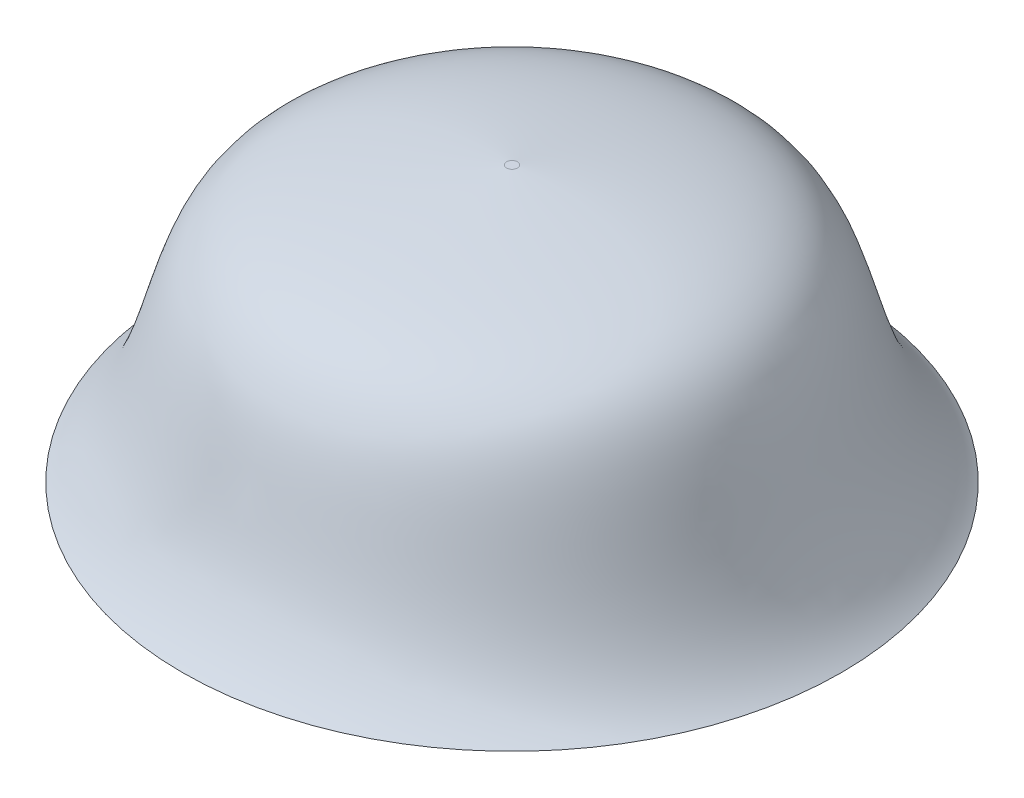
ISO-10303-21;
HEADER;
FILE_DESCRIPTION(('STEP AP214'),'2;1');
FILE_NAME('part.step','',(''),(''),'','','');
FILE_SCHEMA(('AUTOMOTIVE_DESIGN { 1 0 10303 214 1 1 1 1 }'));
ENDSEC;
DATA;
#1=APPLICATION_CONTEXT('core data for automotive mechanical design processes');
#2=APPLICATION_PROTOCOL_DEFINITION('international standard','automotive_design',2000,#1);
#3=PRODUCT_CONTEXT('',#1,'mechanical');
#4=PRODUCT('Part','Part','',(#3));
#5=PRODUCT_RELATED_PRODUCT_CATEGORY('part','',(#4));
#6=PRODUCT_DEFINITION_FORMATION('','',#4);
#7=PRODUCT_DEFINITION_CONTEXT('part definition',#1,'design');
#8=PRODUCT_DEFINITION('design','',#6,#7);
#9=PRODUCT_DEFINITION_SHAPE('','',#8);
#10=(LENGTH_UNIT() NAMED_UNIT(*) SI_UNIT(.MILLI.,.METRE.));
#11=(NAMED_UNIT(*) PLANE_ANGLE_UNIT() SI_UNIT($,.RADIAN.));
#12=(NAMED_UNIT(*) SI_UNIT($,.STERADIAN.) SOLID_ANGLE_UNIT());
#13=UNCERTAINTY_MEASURE_WITH_UNIT(LENGTH_MEASURE(1.E-05),#10,'distance_accuracy_value','');
#14=(GEOMETRIC_REPRESENTATION_CONTEXT(3) GLOBAL_UNCERTAINTY_ASSIGNED_CONTEXT((#13)) GLOBAL_UNIT_ASSIGNED_CONTEXT((#10,
#11,#12)) REPRESENTATION_CONTEXT('',''));
#15=CARTESIAN_POINT('',(0.,0.,0.));
#16=DIRECTION('',(0.,0.,1.));
#17=DIRECTION('',(1.,0.,0.));
#18=AXIS2_PLACEMENT_3D('',#15,#16,#17);
#19=CARTESIAN_POINT('',(2.95,7.,0.));
#20=DIRECTION('',(1.,0.,0.));
#21=DIRECTION('',(0.,0.,-1.));
#22=AXIS2_PLACEMENT_3D('',#19,#20,#21);
#23=PLANE('',#22);
#24=DIRECTION('',(0.,-1.,0.));
#25=VECTOR('',#24,1.);
#26=CARTESIAN_POINT('',(2.95,7.,1.7031832941094));
#27=LINE('',#26,#25);
#28=CARTESIAN_POINT('',(2.95,7.,1.7031832941094));
#29=VERTEX_POINT('',#28);
#30=CARTESIAN_POINT('',(2.95,2.5,1.7031832941094));
#31=VERTEX_POINT('',#30);
#32=EDGE_CURVE('E53',#29,#31,#27,.T.);
#33=ORIENTED_EDGE('',*,*,#32,.T.);
#34=DIRECTION('',(0.,0.,-1.));
#35=VECTOR('',#34,1.);
#36=CARTESIAN_POINT('',(2.95,2.5,0.));
#37=LINE('',#36,#35);
#38=CARTESIAN_POINT('',(2.95,2.5,-1.7031832941094));
#39=VERTEX_POINT('',#38);
#40=EDGE_CURVE('E97',#31,#39,#37,.T.);
#41=ORIENTED_EDGE('',*,*,#40,.T.);
#42=DIRECTION('',(0.,-1.,0.));
#43=VECTOR('',#42,1.);
#44=CARTESIAN_POINT('',(2.95,7.,-1.7031832941094));
#45=LINE('',#44,#43);
#46=CARTESIAN_POINT('',(2.95,7.,-1.7031832941094));
#47=VERTEX_POINT('',#46);
#48=EDGE_CURVE('E106',#47,#39,#45,.T.);
#49=ORIENTED_EDGE('',*,*,#48,.F.);
#50=DIRECTION('',(0.,0.,1.));
#51=VECTOR('',#50,1.);
#52=CARTESIAN_POINT('',(2.95,7.,0.));
#53=LINE('',#52,#51);
#54=EDGE_CURVE('E140',#47,#29,#53,.T.);
#55=ORIENTED_EDGE('',*,*,#54,.T.);
#56=EDGE_LOOP('',(#33,#41,#49,#55));
#57=FACE_BOUND('',#56,.T.);
#58=ADVANCED_FACE('F44',(#57),#23,.T.);
#59=CARTESIAN_POINT('',(1.475,7.,2.55477494116409));
#60=DIRECTION('',(0.5,0.,0.866025403784439));
#61=DIRECTION('',(0.866025403784439,0.,-0.5));
#62=AXIS2_PLACEMENT_3D('',#59,#60,#61);
#63=PLANE('',#62);
#64=DIRECTION('',(0.,-1.,0.));
#65=VECTOR('',#64,1.);
#66=CARTESIAN_POINT('',(0.,7.,3.40636658821879));
#67=LINE('',#66,#65);
#68=CARTESIAN_POINT('',(0.,7.,3.40636658821879));
#69=VERTEX_POINT('',#68);
#70=CARTESIAN_POINT('',(0.,2.5,3.40636658821879));
#71=VERTEX_POINT('',#70);
#72=EDGE_CURVE('E132',#69,#71,#67,.T.);
#73=ORIENTED_EDGE('',*,*,#72,.T.);
#74=DIRECTION('',(0.866025403784439,0.,-0.5));
#75=VECTOR('',#74,1.);
#76=CARTESIAN_POINT('',(1.475,2.5,2.55477494116409));
#77=LINE('',#76,#75);
#78=EDGE_CURVE('E110',#71,#31,#77,.T.);
#79=ORIENTED_EDGE('',*,*,#78,.T.);
#80=ORIENTED_EDGE('',*,*,#32,.F.);
#81=DIRECTION('',(-0.866025403784439,0.,0.5));
#82=VECTOR('',#81,1.);
#83=CARTESIAN_POINT('',(1.475,7.,2.55477494116409));
#84=LINE('',#83,#82);
#85=EDGE_CURVE('E67',#29,#69,#84,.T.);
#86=ORIENTED_EDGE('',*,*,#85,.T.);
#87=EDGE_LOOP('',(#73,#79,#80,#86));
#88=FACE_BOUND('',#87,.T.);
#89=ADVANCED_FACE('F198',(#88),#63,.T.);
#90=CARTESIAN_POINT('',(-1.475,7.,2.5547749411641));
#91=DIRECTION('',(-0.5,0.,0.866025403784439));
#92=DIRECTION('',(0.866025403784439,0.,0.5));
#93=AXIS2_PLACEMENT_3D('',#90,#91,#92);
#94=PLANE('',#93);
#95=DIRECTION('',(0.,-1.,0.));
#96=VECTOR('',#95,1.);
#97=CARTESIAN_POINT('',(-2.95,7.,1.7031832941094));
#98=LINE('',#97,#96);
#99=CARTESIAN_POINT('',(-2.95,7.,1.7031832941094));
#100=VERTEX_POINT('',#99);
#101=CARTESIAN_POINT('',(-2.95,2.5,1.7031832941094));
#102=VERTEX_POINT('',#101);
#103=EDGE_CURVE('E128',#100,#102,#98,.T.);
#104=ORIENTED_EDGE('',*,*,#103,.T.);
#105=DIRECTION('',(0.866025403784439,0.,0.5));
#106=VECTOR('',#105,1.);
#107=CARTESIAN_POINT('',(-1.475,2.5,2.5547749411641));
#108=LINE('',#107,#106);
#109=EDGE_CURVE('E159',#102,#71,#108,.T.);
#110=ORIENTED_EDGE('',*,*,#109,.T.);
#111=ORIENTED_EDGE('',*,*,#72,.F.);
#112=DIRECTION('',(-0.866025403784439,0.,-0.5));
#113=VECTOR('',#112,1.);
#114=CARTESIAN_POINT('',(-1.475,7.,2.5547749411641));
#115=LINE('',#114,#113);
#116=EDGE_CURVE('E144',#69,#100,#115,.T.);
#117=ORIENTED_EDGE('',*,*,#116,.T.);
#118=EDGE_LOOP('',(#104,#110,#111,#117));
#119=FACE_BOUND('',#118,.T.);
#120=ADVANCED_FACE('F201',(#119),#94,.T.);
#121=CARTESIAN_POINT('',(-2.95,7.,0.));
#122=DIRECTION('',(-1.,0.,0.));
#123=DIRECTION('',(0.,0.,1.));
#124=AXIS2_PLACEMENT_3D('',#121,#122,#123);
#125=PLANE('',#124);
#126=DIRECTION('',(0.,-1.,0.));
#127=VECTOR('',#126,1.);
#128=CARTESIAN_POINT('',(-2.95,7.,-1.7031832941094));
#129=LINE('',#128,#127);
#130=CARTESIAN_POINT('',(-2.95,7.,-1.7031832941094));
#131=VERTEX_POINT('',#130);
#132=CARTESIAN_POINT('',(-2.95,2.5,-1.7031832941094));
#133=VERTEX_POINT('',#132);
#134=EDGE_CURVE('E120',#131,#133,#129,.T.);
#135=ORIENTED_EDGE('',*,*,#134,.T.);
#136=DIRECTION('',(0.,0.,1.));
#137=VECTOR('',#136,1.);
#138=CARTESIAN_POINT('',(-2.95,2.5,0.));
#139=LINE('',#138,#137);
#140=EDGE_CURVE('E163',#133,#102,#139,.T.);
#141=ORIENTED_EDGE('',*,*,#140,.T.);
#142=ORIENTED_EDGE('',*,*,#103,.F.);
#143=DIRECTION('',(0.,0.,-1.));
#144=VECTOR('',#143,1.);
#145=CARTESIAN_POINT('',(-2.95,7.,0.));
#146=LINE('',#145,#144);
#147=EDGE_CURVE('E147',#100,#131,#146,.T.);
#148=ORIENTED_EDGE('',*,*,#147,.T.);
#149=EDGE_LOOP('',(#135,#141,#142,#148));
#150=FACE_BOUND('',#149,.T.);
#151=ADVANCED_FACE('F205',(#150),#125,.T.);
#152=CARTESIAN_POINT('',(-1.475,7.,-2.55477494116409));
#153=DIRECTION('',(-0.5,0.,-0.866025403784439));
#154=DIRECTION('',(-0.866025403784439,0.,0.5));
#155=AXIS2_PLACEMENT_3D('',#152,#153,#154);
#156=PLANE('',#155);
#157=DIRECTION('',(0.,-1.,0.));
#158=VECTOR('',#157,1.);
#159=CARTESIAN_POINT('',(0.,7.,-3.40636658821879));
#160=LINE('',#159,#158);
#161=CARTESIAN_POINT('',(0.,7.,-3.40636658821879));
#162=VERTEX_POINT('',#161);
#163=CARTESIAN_POINT('',(0.,2.5,-3.40636658821879));
#164=VERTEX_POINT('',#163);
#165=EDGE_CURVE('E116',#162,#164,#160,.T.);
#166=ORIENTED_EDGE('',*,*,#165,.T.);
#167=DIRECTION('',(-0.866025403784439,0.,0.5));
#168=VECTOR('',#167,1.);
#169=CARTESIAN_POINT('',(-1.475,2.5,-2.55477494116409));
#170=LINE('',#169,#168);
#171=EDGE_CURVE('E60',#164,#133,#170,.T.);
#172=ORIENTED_EDGE('',*,*,#171,.T.);
#173=ORIENTED_EDGE('',*,*,#134,.F.);
#174=DIRECTION('',(0.866025403784439,0.,-0.5));
#175=VECTOR('',#174,1.);
#176=CARTESIAN_POINT('',(-1.475,7.,-2.55477494116409));
#177=LINE('',#176,#175);
#178=EDGE_CURVE('E150',#131,#162,#177,.T.);
#179=ORIENTED_EDGE('',*,*,#178,.T.);
#180=EDGE_LOOP('',(#166,#172,#173,#179));
#181=FACE_BOUND('',#180,.T.);
#182=ADVANCED_FACE('F209',(#181),#156,.T.);
#183=CARTESIAN_POINT('',(1.475,7.,-2.5547749411641));
#184=DIRECTION('',(0.5,0.,-0.866025403784439));
#185=DIRECTION('',(-0.866025403784439,0.,-0.5));
#186=AXIS2_PLACEMENT_3D('',#183,#184,#185);
#187=PLANE('',#186);
#188=ORIENTED_EDGE('',*,*,#48,.T.);
#189=DIRECTION('',(-0.866025403784439,0.,-0.5));
#190=VECTOR('',#189,1.);
#191=CARTESIAN_POINT('',(1.475,2.5,-2.5547749411641));
#192=LINE('',#191,#190);
#193=EDGE_CURVE('E11',#39,#164,#192,.T.);
#194=ORIENTED_EDGE('',*,*,#193,.T.);
#195=ORIENTED_EDGE('',*,*,#165,.F.);
#196=DIRECTION('',(0.866025403784439,0.,0.5));
#197=VECTOR('',#196,1.);
#198=CARTESIAN_POINT('',(1.475,7.,-2.5547749411641));
#199=LINE('',#198,#197);
#200=EDGE_CURVE('E114',#162,#47,#199,.T.);
#201=ORIENTED_EDGE('',*,*,#200,.T.);
#202=EDGE_LOOP('',(#188,#194,#195,#201));
#203=FACE_BOUND('',#202,.T.);
#204=ADVANCED_FACE('F112',(#203),#187,.T.);
#205=CARTESIAN_POINT('',(0.,0.,0.));
#206=DIRECTION('',(0.,1.,0.));
#207=DIRECTION('',(0.,0.,1.));
#208=AXIS2_PLACEMENT_3D('',#205,#206,#207);
#209=PLANE('',#208);
#210=CARTESIAN_POINT('',(0.,0.,0.));
#211=DIRECTION('',(0.,-1.,0.));
#212=DIRECTION('',(0.,0.,-1.));
#213=AXIS2_PLACEMENT_3D('',#210,#211,#212);
#214=CIRCLE('',#213,7.);
#215=CARTESIAN_POINT('',(0.,0.,-7.));
#216=VERTEX_POINT('',#215);
#217=EDGE_CURVE('E109',#216,#216,#214,.T.);
#218=ORIENTED_EDGE('',*,*,#217,.F.);
#219=EDGE_LOOP('',(#218));
#220=FACE_BOUND('',#219,.T.);
#221=CARTESIAN_POINT('',(0.,0.,0.));
#222=DIRECTION('',(0.,1.,0.));
#223=DIRECTION('',(0.,0.,1.));
#224=AXIS2_PLACEMENT_3D('',#221,#222,#223);
#225=CIRCLE('',#224,12.);
#226=CARTESIAN_POINT('',(0.,0.,12.));
#227=VERTEX_POINT('',#226);
#228=EDGE_CURVE('E173',#227,#227,#225,.T.);
#229=ORIENTED_EDGE('',*,*,#228,.F.);
#230=EDGE_LOOP('',(#229));
#231=FACE_BOUND('',#230,.T.);
#232=ADVANCED_FACE('F46',(#220,#231),#209,.F.);
#233=CARTESIAN_POINT('',(0.,7.,0.));
#234=DIRECTION('',(0.,-1.,0.));
#235=DIRECTION('',(0.,0.,-1.));
#236=AXIS2_PLACEMENT_3D('',#233,#234,#235);
#237=CYLINDRICAL_SURFACE('',#236,7.);
#238=CARTESIAN_POINT('',(0.,7.,0.));
#239=DIRECTION('',(0.,-1.,0.));
#240=DIRECTION('',(0.,0.,-1.));
#241=AXIS2_PLACEMENT_3D('',#238,#239,#240);
#242=CIRCLE('',#241,7.);
#243=CARTESIAN_POINT('',(0.,7.,-7.));
#244=VERTEX_POINT('',#243);
#245=EDGE_CURVE('E117',#244,#244,#242,.T.);
#246=ORIENTED_EDGE('',*,*,#245,.F.);
#247=EDGE_LOOP('',(#246));
#248=FACE_BOUND('',#247,.T.);
#249=ORIENTED_EDGE('',*,*,#217,.T.);
#250=EDGE_LOOP('',(#249));
#251=FACE_BOUND('',#250,.T.);
#252=ADVANCED_FACE('F194',(#248,#251),#237,.F.);
#253=CARTESIAN_POINT('',(0.,7.,0.));
#254=DIRECTION('',(0.,-1.,0.));
#255=DIRECTION('',(0.,0.,-1.));
#256=AXIS2_PLACEMENT_3D('',#253,#254,#255);
#257=PLANE('',#256);
#258=ORIENTED_EDGE('',*,*,#54,.F.);
#259=ORIENTED_EDGE('',*,*,#200,.F.);
#260=ORIENTED_EDGE('',*,*,#178,.F.);
#261=ORIENTED_EDGE('',*,*,#147,.F.);
#262=ORIENTED_EDGE('',*,*,#116,.F.);
#263=ORIENTED_EDGE('',*,*,#85,.F.);
#264=EDGE_LOOP('',(#258,#259,#260,#261,#262,#263));
#265=FACE_BOUND('',#264,.T.);
#266=ORIENTED_EDGE('',*,*,#245,.T.);
#267=EDGE_LOOP('',(#266));
#268=FACE_BOUND('',#267,.T.);
#269=ADVANCED_FACE('F191',(#265,#268),#257,.T.);
#270=CARTESIAN_POINT('',(0.,2.5,0.));
#271=DIRECTION('',(0.,-1.,0.));
#272=DIRECTION('',(0.,0.,-1.));
#273=AXIS2_PLACEMENT_3D('',#270,#271,#272);
#274=PLANE('',#273);
#275=ORIENTED_EDGE('',*,*,#78,.F.);
#276=ORIENTED_EDGE('',*,*,#109,.F.);
#277=ORIENTED_EDGE('',*,*,#140,.F.);
#278=ORIENTED_EDGE('',*,*,#171,.F.);
#279=ORIENTED_EDGE('',*,*,#193,.F.);
#280=ORIENTED_EDGE('',*,*,#40,.F.);
#281=EDGE_LOOP('',(#275,#276,#277,#278,#279,#280));
#282=FACE_BOUND('',#281,.T.);
#283=ADVANCED_FACE('F96',(#282),#274,.T.);
#284=CARTESIAN_POINT('',(-0.197481425130252,10.,0.));
#285=CARTESIAN_POINT('',(-8.1498127340824,9.33004993757802,0.));
#286=CARTESIAN_POINT('',(-7.76948813982522,8.02607990012483,0.));
#287=CARTESIAN_POINT('',(-10.0786017478152,8.37923845193507,0.));
#288=CARTESIAN_POINT('',(-8.74746566791511,2.51137328339574,0.));
#289=CARTESIAN_POINT('',(-12.,0.,0.));
#290=B_SPLINE_CURVE_WITH_KNOTS('',5,(#284,#285,#286,#287,#288,#289),.UNSPECIFIED.,.F.,.F.,(6,6),
(0.,1.),.UNSPECIFIED.);
#291=CARTESIAN_POINT('',(0.,10.0766628708533,0.));
#292=DIRECTION('',(0.,1.,0.));
#293=AXIS1_PLACEMENT('',#291,#292);
#294=SURFACE_OF_REVOLUTION('',#290,#293);
#295=ORIENTED_EDGE('',*,*,#228,.T.);
#296=EDGE_LOOP('',(#295));
#297=FACE_BOUND('',#296,.T.);
#298=CARTESIAN_POINT('',(0.,10.,0.));
#299=DIRECTION('',(0.,1.,0.));
#300=DIRECTION('',(0.,0.,1.));
#301=AXIS2_PLACEMENT_3D('',#298,#299,#300);
#302=CIRCLE('',#301,0.197481425130252);
#303=CARTESIAN_POINT('',(0.,10.,0.197481425130252));
#304=VERTEX_POINT('',#303);
#305=EDGE_CURVE('E169',#304,#304,#302,.T.);
#306=ORIENTED_EDGE('',*,*,#305,.F.);
#307=EDGE_LOOP('',(#306));
#308=FACE_BOUND('',#307,.T.);
#309=ADVANCED_FACE('F184',(#297,#308),#294,.F.);
#310=CARTESIAN_POINT('',(0.,10.,0.));
#311=DIRECTION('',(0.,1.,0.));
#312=DIRECTION('',(0.,0.,1.));
#313=AXIS2_PLACEMENT_3D('',#310,#311,#312);
#314=PLANE('',#313);
#315=ORIENTED_EDGE('',*,*,#305,.T.);
#316=EDGE_LOOP('',(#315));
#317=FACE_BOUND('',#316,.T.);
#318=ADVANCED_FACE('F187',(#317),#314,.T.);
#319=CLOSED_SHELL('',(#58,#89,#120,#151,#182,#204,#232,#252,#269,#283,#309,#318));
#320=MANIFOLD_SOLID_BREP('B2',#319);
#321=ADVANCED_BREP_SHAPE_REPRESENTATION('',(#18,#320),#14);
#322=SHAPE_DEFINITION_REPRESENTATION(#9,#321);
ENDSEC;
END-ISO-10303-21;
